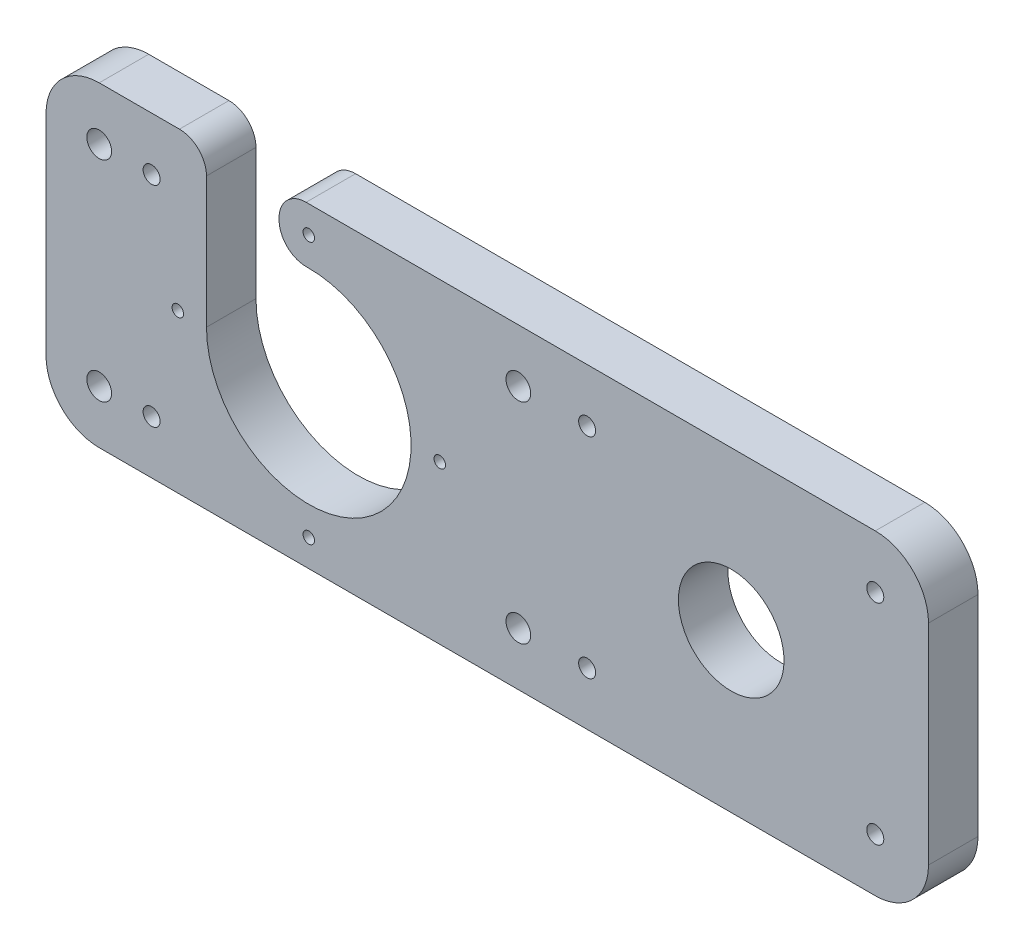
ISO-10303-21;
HEADER;
FILE_DESCRIPTION(('STEP AP214'),'2;1');
FILE_NAME('part.step','',(''),(''),'','','');
FILE_SCHEMA(('AUTOMOTIVE_DESIGN { 1 0 10303 214 1 1 1 1 }'));
ENDSEC;
DATA;
#1=APPLICATION_CONTEXT('core data for automotive mechanical design processes');
#2=APPLICATION_PROTOCOL_DEFINITION('international standard','automotive_design',2000,#1);
#3=PRODUCT_CONTEXT('',#1,'mechanical');
#4=PRODUCT('Part','Part','',(#3));
#5=PRODUCT_RELATED_PRODUCT_CATEGORY('part','',(#4));
#6=PRODUCT_DEFINITION_FORMATION('','',#4);
#7=PRODUCT_DEFINITION_CONTEXT('part definition',#1,'design');
#8=PRODUCT_DEFINITION('design','',#6,#7);
#9=PRODUCT_DEFINITION_SHAPE('','',#8);
#10=(LENGTH_UNIT() NAMED_UNIT(*) SI_UNIT(.MILLI.,.METRE.));
#11=(NAMED_UNIT(*) PLANE_ANGLE_UNIT() SI_UNIT($,.RADIAN.));
#12=(NAMED_UNIT(*) SI_UNIT($,.STERADIAN.) SOLID_ANGLE_UNIT());
#13=UNCERTAINTY_MEASURE_WITH_UNIT(LENGTH_MEASURE(1.E-05),#10,'distance_accuracy_value','');
#14=(GEOMETRIC_REPRESENTATION_CONTEXT(3) GLOBAL_UNCERTAINTY_ASSIGNED_CONTEXT((#13)) GLOBAL_UNIT_ASSIGNED_CONTEXT((#10,
#11,#12)) REPRESENTATION_CONTEXT('',''));
#15=CARTESIAN_POINT('',(0.,0.,0.));
#16=DIRECTION('',(0.,0.,1.));
#17=DIRECTION('',(1.,0.,0.));
#18=AXIS2_PLACEMENT_3D('',#15,#16,#17);
#19=CARTESIAN_POINT('',(0.,38.2,5.8));
#20=DIRECTION('',(0.,-1.,0.));
#21=DIRECTION('',(1.,0.,0.));
#22=AXIS2_PLACEMENT_3D('',#19,#20,#21);
#23=PLANE('',#22);
#24=DIRECTION('',(-1.,0.,0.));
#25=VECTOR('',#24,1.);
#26=CARTESIAN_POINT('',(0.,38.2,-0.1));
#27=LINE('',#26,#25);
#28=CARTESIAN_POINT('',(100.4125,38.2,-0.1));
#29=VERTEX_POINT('',#28);
#30=CARTESIAN_POINT('',(31.425,38.2,-0.1));
#31=VERTEX_POINT('',#30);
#32=EDGE_CURVE('E387',#29,#31,#27,.T.);
#33=ORIENTED_EDGE('',*,*,#32,.T.);
#34=DIRECTION('',(0.,0.,1.));
#35=VECTOR('',#34,1.);
#36=CARTESIAN_POINT('',(31.425,38.2,5.8));
#37=LINE('',#36,#35);
#38=CARTESIAN_POINT('',(31.425,38.2,5.9));
#39=VERTEX_POINT('',#38);
#40=EDGE_CURVE('E12',#31,#39,#37,.T.);
#41=ORIENTED_EDGE('',*,*,#40,.T.);
#42=DIRECTION('',(-1.,0.,0.));
#43=VECTOR('',#42,1.);
#44=CARTESIAN_POINT('',(0.,38.2,5.9));
#45=LINE('',#44,#43);
#46=CARTESIAN_POINT('',(100.4125,38.2,5.9));
#47=VERTEX_POINT('',#46);
#48=EDGE_CURVE('E237',#47,#39,#45,.T.);
#49=ORIENTED_EDGE('',*,*,#48,.F.);
#50=DIRECTION('',(0.,0.,1.));
#51=VECTOR('',#50,1.);
#52=CARTESIAN_POINT('',(100.4125,38.2,5.8));
#53=LINE('',#52,#51);
#54=EDGE_CURVE('E42',#47,#29,#53,.F.);
#55=ORIENTED_EDGE('',*,*,#54,.T.);
#56=EDGE_LOOP('',(#33,#41,#49,#55));
#57=FACE_BOUND('',#56,.T.);
#58=ADVANCED_FACE('F38',(#57),#23,.F.);
#59=CARTESIAN_POINT('',(0.,0.,5.9));
#60=DIRECTION('',(0.,0.,-1.));
#61=DIRECTION('',(-1.,0.,0.));
#62=AXIS2_PLACEMENT_3D('',#59,#60,#61);
#63=PLANE('',#62);
#64=CARTESIAN_POINT('',(6.35,6.35000000000001,5.9));
#65=DIRECTION('',(0.,0.,-1.));
#66=DIRECTION('',(-1.,0.,0.));
#67=AXIS2_PLACEMENT_3D('',#64,#65,#66);
#68=CIRCLE('',#67,1.5);
#69=CARTESIAN_POINT('',(4.85,6.35000000000001,5.9));
#70=VERTEX_POINT('',#69);
#71=EDGE_CURVE('E461',#70,#70,#68,.F.);
#72=ORIENTED_EDGE('',*,*,#71,.F.);
#73=EDGE_LOOP('',(#72));
#74=FACE_BOUND('',#73,.T.);
#75=CARTESIAN_POINT('',(6.35,31.75,5.9));
#76=DIRECTION('',(0.,0.,-1.));
#77=DIRECTION('',(-1.,0.,0.));
#78=AXIS2_PLACEMENT_3D('',#75,#76,#77);
#79=CIRCLE('',#78,1.5);
#80=CARTESIAN_POINT('',(4.85,31.75,5.9));
#81=VERTEX_POINT('',#80);
#82=EDGE_CURVE('E328',#81,#81,#79,.F.);
#83=ORIENTED_EDGE('',*,*,#82,.F.);
#84=EDGE_LOOP('',(#83));
#85=FACE_BOUND('',#84,.T.);
#86=CARTESIAN_POINT('',(57.15,31.75,5.9));
#87=DIRECTION('',(0.,0.,-1.));
#88=DIRECTION('',(-1.,0.,0.));
#89=AXIS2_PLACEMENT_3D('',#86,#87,#88);
#90=CIRCLE('',#89,1.5);
#91=CARTESIAN_POINT('',(55.65,31.75,5.9));
#92=VERTEX_POINT('',#91);
#93=EDGE_CURVE('E333',#92,#92,#90,.F.);
#94=ORIENTED_EDGE('',*,*,#93,.F.);
#95=EDGE_LOOP('',(#94));
#96=FACE_BOUND('',#95,.T.);
#97=CARTESIAN_POINT('',(57.15,6.35,5.9));
#98=DIRECTION('',(0.,0.,-1.));
#99=DIRECTION('',(-1.,0.,0.));
#100=AXIS2_PLACEMENT_3D('',#97,#98,#99);
#101=CIRCLE('',#100,1.5);
#102=CARTESIAN_POINT('',(55.65,6.35,5.9));
#103=VERTEX_POINT('',#102);
#104=EDGE_CURVE('E337',#103,#103,#101,.F.);
#105=ORIENTED_EDGE('',*,*,#104,.F.);
#106=EDGE_LOOP('',(#105));
#107=FACE_BOUND('',#106,.T.);
#108=CARTESIAN_POINT('',(31.75,34.925,5.9));
#109=DIRECTION('',(0.,0.,-1.));
#110=DIRECTION('',(-1.,0.,0.));
#111=AXIS2_PLACEMENT_3D('',#108,#109,#110);
#112=CIRCLE('',#111,0.693749999999993);
#113=CARTESIAN_POINT('',(31.05625,34.925,5.9));
#114=VERTEX_POINT('',#113);
#115=EDGE_CURVE('E341',#114,#114,#112,.F.);
#116=ORIENTED_EDGE('',*,*,#115,.F.);
#117=EDGE_LOOP('',(#116));
#118=FACE_BOUND('',#117,.T.);
#119=CARTESIAN_POINT('',(15.875,19.05,5.9));
#120=DIRECTION('',(0.,0.,-1.));
#121=DIRECTION('',(-1.,0.,0.));
#122=AXIS2_PLACEMENT_3D('',#119,#120,#121);
#123=CIRCLE('',#122,0.693749999999999);
#124=CARTESIAN_POINT('',(15.18125,19.05,5.9));
#125=VERTEX_POINT('',#124);
#126=EDGE_CURVE('E345',#125,#125,#123,.F.);
#127=ORIENTED_EDGE('',*,*,#126,.F.);
#128=EDGE_LOOP('',(#127));
#129=FACE_BOUND('',#128,.T.);
#130=CARTESIAN_POINT('',(31.75,3.175,5.9));
#131=DIRECTION('',(0.,0.,-1.));
#132=DIRECTION('',(-1.,0.,0.));
#133=AXIS2_PLACEMENT_3D('',#130,#131,#132);
#134=CIRCLE('',#133,0.69375);
#135=CARTESIAN_POINT('',(31.05625,3.175,5.9));
#136=VERTEX_POINT('',#135);
#137=EDGE_CURVE('E349',#136,#136,#134,.F.);
#138=ORIENTED_EDGE('',*,*,#137,.F.);
#139=EDGE_LOOP('',(#138));
#140=FACE_BOUND('',#139,.T.);
#141=CARTESIAN_POINT('',(47.625,19.05,5.9));
#142=DIRECTION('',(0.,0.,-1.));
#143=DIRECTION('',(-1.,0.,0.));
#144=AXIS2_PLACEMENT_3D('',#141,#142,#143);
#145=CIRCLE('',#144,0.693749999999999);
#146=CARTESIAN_POINT('',(46.93125,19.05,5.9));
#147=VERTEX_POINT('',#146);
#148=EDGE_CURVE('E353',#147,#147,#145,.F.);
#149=ORIENTED_EDGE('',*,*,#148,.F.);
#150=EDGE_LOOP('',(#149));
#151=FACE_BOUND('',#150,.T.);
#152=CARTESIAN_POINT('',(12.7,31.75,5.9));
#153=DIRECTION('',(0.,0.,-1.));
#154=DIRECTION('',(-1.,0.,0.));
#155=AXIS2_PLACEMENT_3D('',#152,#153,#154);
#156=CIRCLE('',#155,1.0303);
#157=CARTESIAN_POINT('',(11.6697,31.75,5.9));
#158=VERTEX_POINT('',#157);
#159=EDGE_CURVE('E192',#158,#158,#156,.F.);
#160=ORIENTED_EDGE('',*,*,#159,.F.);
#161=EDGE_LOOP('',(#160));
#162=FACE_BOUND('',#161,.T.);
#163=CARTESIAN_POINT('',(12.7,6.35000000000001,5.9));
#164=DIRECTION('',(0.,0.,-1.));
#165=DIRECTION('',(-1.,0.,0.));
#166=AXIS2_PLACEMENT_3D('',#163,#164,#165);
#167=CIRCLE('',#166,1.0303);
#168=CARTESIAN_POINT('',(11.6697,6.35000000000001,5.9));
#169=VERTEX_POINT('',#168);
#170=EDGE_CURVE('E303',#169,#169,#167,.F.);
#171=ORIENTED_EDGE('',*,*,#170,.F.);
#172=EDGE_LOOP('',(#171));
#173=FACE_BOUND('',#172,.T.);
#174=CARTESIAN_POINT('',(100.4125,6.35000000000001,5.9));
#175=DIRECTION('',(0.,0.,-1.));
#176=DIRECTION('',(-1.,0.,0.));
#177=AXIS2_PLACEMENT_3D('',#174,#175,#176);
#178=CIRCLE('',#177,1.0303);
#179=CARTESIAN_POINT('',(99.3822,6.35000000000001,5.9));
#180=VERTEX_POINT('',#179);
#181=EDGE_CURVE('E307',#180,#180,#178,.F.);
#182=ORIENTED_EDGE('',*,*,#181,.F.);
#183=EDGE_LOOP('',(#182));
#184=FACE_BOUND('',#183,.T.);
#185=CARTESIAN_POINT('',(100.4125,31.75,5.9));
#186=DIRECTION('',(0.,0.,-1.));
#187=DIRECTION('',(-1.,0.,0.));
#188=AXIS2_PLACEMENT_3D('',#185,#186,#187);
#189=CIRCLE('',#188,1.0303);
#190=CARTESIAN_POINT('',(99.3822,31.75,5.9));
#191=VERTEX_POINT('',#190);
#192=EDGE_CURVE('E311',#191,#191,#189,.F.);
#193=ORIENTED_EDGE('',*,*,#192,.F.);
#194=EDGE_LOOP('',(#193));
#195=FACE_BOUND('',#194,.T.);
#196=CARTESIAN_POINT('',(65.4875,31.75,5.9));
#197=DIRECTION('',(0.,0.,-1.));
#198=DIRECTION('',(-1.,0.,0.));
#199=AXIS2_PLACEMENT_3D('',#196,#197,#198);
#200=CIRCLE('',#199,1.0303);
#201=CARTESIAN_POINT('',(64.4572,31.75,5.9));
#202=VERTEX_POINT('',#201);
#203=EDGE_CURVE('E315',#202,#202,#200,.F.);
#204=ORIENTED_EDGE('',*,*,#203,.F.);
#205=EDGE_LOOP('',(#204));
#206=FACE_BOUND('',#205,.T.);
#207=CARTESIAN_POINT('',(65.4875,6.35000000000001,5.9));
#208=DIRECTION('',(0.,0.,-1.));
#209=DIRECTION('',(-1.,0.,0.));
#210=AXIS2_PLACEMENT_3D('',#207,#208,#209);
#211=CIRCLE('',#210,1.0303);
#212=CARTESIAN_POINT('',(64.4572,6.35000000000001,5.9));
#213=VERTEX_POINT('',#212);
#214=EDGE_CURVE('E319',#213,#213,#211,.F.);
#215=ORIENTED_EDGE('',*,*,#214,.F.);
#216=EDGE_LOOP('',(#215));
#217=FACE_BOUND('',#216,.T.);
#218=CARTESIAN_POINT('',(82.95,19.05,5.9));
#219=DIRECTION('',(0.,0.,-1.));
#220=DIRECTION('',(-1.,0.,0.));
#221=AXIS2_PLACEMENT_3D('',#218,#219,#220);
#222=CIRCLE('',#221,6.4);
#223=CARTESIAN_POINT('',(76.55,19.05,5.9));
#224=VERTEX_POINT('',#223);
#225=EDGE_CURVE('E326',#224,#224,#222,.F.);
#226=ORIENTED_EDGE('',*,*,#225,.F.);
#227=EDGE_LOOP('',(#226));
#228=FACE_BOUND('',#227,.T.);
#229=DIRECTION('',(0.,1.,0.));
#230=VECTOR('',#229,1.);
#231=CARTESIAN_POINT('',(28.15,19.05,5.9));
#232=LINE('',#231,#230);
#233=CARTESIAN_POINT('',(28.15,34.7216304193278,5.9));
#234=VERTEX_POINT('',#233);
#235=CARTESIAN_POINT('',(28.15,34.925,5.9));
#236=VERTEX_POINT('',#235);
#237=EDGE_CURVE('E372',#234,#236,#232,.T.);
#238=ORIENTED_EDGE('',*,*,#237,.F.);
#239=CARTESIAN_POINT('',(31.425,34.7216304193278,5.9));
#240=DIRECTION('',(0.,0.,-1.));
#241=DIRECTION('',(-1.,0.,0.));
#242=AXIS2_PLACEMENT_3D('',#239,#240,#241);
#243=CIRCLE('',#242,3.275);
#244=CARTESIAN_POINT('',(31.4929027113238,31.4473344306006,5.9));
#245=VERTEX_POINT('',#244);
#246=EDGE_CURVE('E179',#234,#245,#243,.F.);
#247=ORIENTED_EDGE('',*,*,#246,.T.);
#248=CARTESIAN_POINT('',(31.75,19.05,5.9));
#249=DIRECTION('',(0.,0.,-1.));
#250=DIRECTION('',(-1.,0.,0.));
#251=AXIS2_PLACEMENT_3D('',#248,#249,#250);
#252=CIRCLE('',#251,12.4);
#253=CARTESIAN_POINT('',(19.35,19.05,5.9));
#254=VERTEX_POINT('',#253);
#255=EDGE_CURVE('E327',#254,#245,#252,.F.);
#256=ORIENTED_EDGE('',*,*,#255,.F.);
#257=DIRECTION('',(0.,-1.,0.));
#258=VECTOR('',#257,1.);
#259=CARTESIAN_POINT('',(19.35,19.05,5.9));
#260=LINE('',#259,#258);
#261=CARTESIAN_POINT('',(19.35,34.925,5.9));
#262=VERTEX_POINT('',#261);
#263=EDGE_CURVE('E176',#262,#254,#260,.T.);
#264=ORIENTED_EDGE('',*,*,#263,.F.);
#265=CARTESIAN_POINT('',(16.075,34.925,5.9));
#266=DIRECTION('',(0.,0.,-1.));
#267=DIRECTION('',(-1.,0.,0.));
#268=AXIS2_PLACEMENT_3D('',#265,#266,#267);
#269=CIRCLE('',#268,3.275);
#270=CARTESIAN_POINT('',(16.075,38.2,5.9));
#271=VERTEX_POINT('',#270);
#272=EDGE_CURVE('E182',#262,#271,#269,.F.);
#273=ORIENTED_EDGE('',*,*,#272,.T.);
#274=DIRECTION('',(-1.,0.,0.));
#275=VECTOR('',#274,1.);
#276=CARTESIAN_POINT('',(0.,38.2,5.9));
#277=LINE('',#276,#275);
#278=CARTESIAN_POINT('',(6.35,38.2,5.9));
#279=VERTEX_POINT('',#278);
#280=EDGE_CURVE('E235',#271,#279,#277,.T.);
#281=ORIENTED_EDGE('',*,*,#280,.T.);
#282=CARTESIAN_POINT('',(6.35,31.75,5.9));
#283=DIRECTION('',(0.,0.,-1.));
#284=DIRECTION('',(-1.,0.,0.));
#285=AXIS2_PLACEMENT_3D('',#282,#283,#284);
#286=CIRCLE('',#285,6.45);
#287=CARTESIAN_POINT('',(-0.1,31.75,5.9));
#288=VERTEX_POINT('',#287);
#289=EDGE_CURVE('E205',#279,#288,#286,.F.);
#290=ORIENTED_EDGE('',*,*,#289,.T.);
#291=DIRECTION('',(0.,-1.,0.));
#292=VECTOR('',#291,1.);
#293=CARTESIAN_POINT('',(-0.1,0.,5.9));
#294=LINE('',#293,#292);
#295=CARTESIAN_POINT('',(-0.1,6.35,5.9));
#296=VERTEX_POINT('',#295);
#297=EDGE_CURVE('E210',#288,#296,#294,.T.);
#298=ORIENTED_EDGE('',*,*,#297,.T.);
#299=CARTESIAN_POINT('',(6.34999999999999,6.35,5.9));
#300=DIRECTION('',(0.,0.,-1.));
#301=DIRECTION('',(-1.,0.,0.));
#302=AXIS2_PLACEMENT_3D('',#299,#300,#301);
#303=CIRCLE('',#302,6.45);
#304=CARTESIAN_POINT('',(6.34999999999999,-0.1,5.9));
#305=VERTEX_POINT('',#304);
#306=EDGE_CURVE('E214',#296,#305,#303,.F.);
#307=ORIENTED_EDGE('',*,*,#306,.T.);
#308=DIRECTION('',(1.,0.,0.));
#309=VECTOR('',#308,1.);
#310=CARTESIAN_POINT('',(0.,-0.1,5.9));
#311=LINE('',#310,#309);
#312=CARTESIAN_POINT('',(100.4125,-0.1,5.9));
#313=VERTEX_POINT('',#312);
#314=EDGE_CURVE('E230',#305,#313,#311,.T.);
#315=ORIENTED_EDGE('',*,*,#314,.T.);
#316=CARTESIAN_POINT('',(100.4125,6.35,5.9));
#317=DIRECTION('',(0.,0.,-1.));
#318=DIRECTION('',(-1.,0.,0.));
#319=AXIS2_PLACEMENT_3D('',#316,#317,#318);
#320=CIRCLE('',#319,6.45);
#321=CARTESIAN_POINT('',(106.8625,6.35,5.9));
#322=VERTEX_POINT('',#321);
#323=EDGE_CURVE('E220',#313,#322,#320,.F.);
#324=ORIENTED_EDGE('',*,*,#323,.T.);
#325=DIRECTION('',(0.,1.,0.));
#326=VECTOR('',#325,1.);
#327=CARTESIAN_POINT('',(106.8625,0.,5.9));
#328=LINE('',#327,#326);
#329=CARTESIAN_POINT('',(106.8625,31.75,5.9));
#330=VERTEX_POINT('',#329);
#331=EDGE_CURVE('E231',#322,#330,#328,.T.);
#332=ORIENTED_EDGE('',*,*,#331,.T.);
#333=CARTESIAN_POINT('',(100.4125,31.75,5.9));
#334=DIRECTION('',(0.,0.,-1.));
#335=DIRECTION('',(-1.,0.,0.));
#336=AXIS2_PLACEMENT_3D('',#333,#334,#335);
#337=CIRCLE('',#336,6.45);
#338=EDGE_CURVE('E225',#330,#47,#337,.F.);
#339=ORIENTED_EDGE('',*,*,#338,.T.);
#340=ORIENTED_EDGE('',*,*,#48,.T.);
#341=CARTESIAN_POINT('',(31.425,34.925,5.9));
#342=DIRECTION('',(0.,0.,-1.));
#343=DIRECTION('',(-1.,0.,0.));
#344=AXIS2_PLACEMENT_3D('',#341,#342,#343);
#345=CIRCLE('',#344,3.275);
#346=EDGE_CURVE('E180',#39,#236,#345,.F.);
#347=ORIENTED_EDGE('',*,*,#346,.T.);
#348=EDGE_LOOP('',(#238,#247,#256,#264,#273,#281,#290,#298,#307,#315,#324,#332,#339,#340,#347));
#349=FACE_BOUND('',#348,.T.);
#350=ADVANCED_FACE('F40',(#74,#85,#96,#107,#118,#129,#140,#151,#162,#173,#184,#195,#206,#217,
#228,#349),#63,.F.);
#351=CARTESIAN_POINT('',(0.,0.,-0.1));
#352=DIRECTION('',(0.,0.,-1.));
#353=DIRECTION('',(-1.,0.,0.));
#354=AXIS2_PLACEMENT_3D('',#351,#352,#353);
#355=PLANE('',#354);
#356=CARTESIAN_POINT('',(6.35,6.35000000000001,-0.1));
#357=DIRECTION('',(0.,0.,-1.));
#358=DIRECTION('',(-1.,0.,0.));
#359=AXIS2_PLACEMENT_3D('',#356,#357,#358);
#360=CIRCLE('',#359,1.5);
#361=CARTESIAN_POINT('',(4.85,6.35000000000001,-0.1));
#362=VERTEX_POINT('',#361);
#363=EDGE_CURVE('E332',#362,#362,#360,.F.);
#364=ORIENTED_EDGE('',*,*,#363,.T.);
#365=EDGE_LOOP('',(#364));
#366=FACE_BOUND('',#365,.T.);
#367=CARTESIAN_POINT('',(6.35,31.75,-0.1));
#368=DIRECTION('',(0.,0.,-1.));
#369=DIRECTION('',(-1.,0.,0.));
#370=AXIS2_PLACEMENT_3D('',#367,#368,#369);
#371=CIRCLE('',#370,1.5);
#372=CARTESIAN_POINT('',(4.85,31.75,-0.1));
#373=VERTEX_POINT('',#372);
#374=EDGE_CURVE('E331',#373,#373,#371,.F.);
#375=ORIENTED_EDGE('',*,*,#374,.T.);
#376=EDGE_LOOP('',(#375));
#377=FACE_BOUND('',#376,.T.);
#378=CARTESIAN_POINT('',(57.15,31.75,-0.1));
#379=DIRECTION('',(0.,0.,-1.));
#380=DIRECTION('',(-1.,0.,0.));
#381=AXIS2_PLACEMENT_3D('',#378,#379,#380);
#382=CIRCLE('',#381,1.5);
#383=CARTESIAN_POINT('',(55.65,31.75,-0.1));
#384=VERTEX_POINT('',#383);
#385=EDGE_CURVE('E336',#384,#384,#382,.F.);
#386=ORIENTED_EDGE('',*,*,#385,.T.);
#387=EDGE_LOOP('',(#386));
#388=FACE_BOUND('',#387,.T.);
#389=CARTESIAN_POINT('',(57.15,6.35,-0.1));
#390=DIRECTION('',(0.,0.,-1.));
#391=DIRECTION('',(-1.,0.,0.));
#392=AXIS2_PLACEMENT_3D('',#389,#390,#391);
#393=CIRCLE('',#392,1.5);
#394=CARTESIAN_POINT('',(55.65,6.35,-0.1));
#395=VERTEX_POINT('',#394);
#396=EDGE_CURVE('E340',#395,#395,#393,.F.);
#397=ORIENTED_EDGE('',*,*,#396,.T.);
#398=EDGE_LOOP('',(#397));
#399=FACE_BOUND('',#398,.T.);
#400=CARTESIAN_POINT('',(31.75,34.925,-0.1));
#401=DIRECTION('',(0.,0.,-1.));
#402=DIRECTION('',(-1.,0.,0.));
#403=AXIS2_PLACEMENT_3D('',#400,#401,#402);
#404=CIRCLE('',#403,0.693749999999993);
#405=CARTESIAN_POINT('',(31.05625,34.925,-0.1));
#406=VERTEX_POINT('',#405);
#407=EDGE_CURVE('E344',#406,#406,#404,.F.);
#408=ORIENTED_EDGE('',*,*,#407,.T.);
#409=EDGE_LOOP('',(#408));
#410=FACE_BOUND('',#409,.T.);
#411=CARTESIAN_POINT('',(15.875,19.05,-0.1));
#412=DIRECTION('',(0.,0.,-1.));
#413=DIRECTION('',(-1.,0.,0.));
#414=AXIS2_PLACEMENT_3D('',#411,#412,#413);
#415=CIRCLE('',#414,0.693749999999999);
#416=CARTESIAN_POINT('',(15.18125,19.05,-0.1));
#417=VERTEX_POINT('',#416);
#418=EDGE_CURVE('E348',#417,#417,#415,.F.);
#419=ORIENTED_EDGE('',*,*,#418,.T.);
#420=EDGE_LOOP('',(#419));
#421=FACE_BOUND('',#420,.T.);
#422=CARTESIAN_POINT('',(31.75,3.175,-0.1));
#423=DIRECTION('',(0.,0.,-1.));
#424=DIRECTION('',(-1.,0.,0.));
#425=AXIS2_PLACEMENT_3D('',#422,#423,#424);
#426=CIRCLE('',#425,0.69375);
#427=CARTESIAN_POINT('',(31.05625,3.175,-0.1));
#428=VERTEX_POINT('',#427);
#429=EDGE_CURVE('E352',#428,#428,#426,.F.);
#430=ORIENTED_EDGE('',*,*,#429,.T.);
#431=EDGE_LOOP('',(#430));
#432=FACE_BOUND('',#431,.T.);
#433=CARTESIAN_POINT('',(47.625,19.05,-0.1));
#434=DIRECTION('',(0.,0.,-1.));
#435=DIRECTION('',(-1.,0.,0.));
#436=AXIS2_PLACEMENT_3D('',#433,#434,#435);
#437=CIRCLE('',#436,0.693749999999999);
#438=CARTESIAN_POINT('',(46.93125,19.05,-0.1));
#439=VERTEX_POINT('',#438);
#440=EDGE_CURVE('E356',#439,#439,#437,.F.);
#441=ORIENTED_EDGE('',*,*,#440,.T.);
#442=EDGE_LOOP('',(#441));
#443=FACE_BOUND('',#442,.T.);
#444=CARTESIAN_POINT('',(31.75,19.05,-0.1));
#445=DIRECTION('',(0.,0.,-1.));
#446=DIRECTION('',(-1.,0.,0.));
#447=AXIS2_PLACEMENT_3D('',#444,#445,#446);
#448=CIRCLE('',#447,12.4);
#449=CARTESIAN_POINT('',(19.35,19.05,-0.1));
#450=VERTEX_POINT('',#449);
#451=CARTESIAN_POINT('',(31.4929027113238,31.4473344306006,-0.1));
#452=VERTEX_POINT('',#451);
#453=EDGE_CURVE('E161',#450,#452,#448,.F.);
#454=ORIENTED_EDGE('',*,*,#453,.T.);
#455=CARTESIAN_POINT('',(31.425,34.7216304193278,-0.1));
#456=DIRECTION('',(0.,0.,-1.));
#457=DIRECTION('',(-1.,0.,0.));
#458=AXIS2_PLACEMENT_3D('',#455,#456,#457);
#459=CIRCLE('',#458,3.275);
#460=CARTESIAN_POINT('',(28.15,34.7216304193278,-0.1));
#461=VERTEX_POINT('',#460);
#462=EDGE_CURVE('E154',#452,#461,#459,.T.);
#463=ORIENTED_EDGE('',*,*,#462,.T.);
#464=DIRECTION('',(0.,1.,0.));
#465=VECTOR('',#464,1.);
#466=CARTESIAN_POINT('',(28.15,19.05,-0.1));
#467=LINE('',#466,#465);
#468=CARTESIAN_POINT('',(28.15,34.925,-0.1));
#469=VERTEX_POINT('',#468);
#470=EDGE_CURVE('E158',#461,#469,#467,.T.);
#471=ORIENTED_EDGE('',*,*,#470,.T.);
#472=CARTESIAN_POINT('',(31.425,34.925,-0.1));
#473=DIRECTION('',(0.,0.,-1.));
#474=DIRECTION('',(-1.,0.,0.));
#475=AXIS2_PLACEMENT_3D('',#472,#473,#474);
#476=CIRCLE('',#475,3.275);
#477=EDGE_CURVE('E188',#469,#31,#476,.T.);
#478=ORIENTED_EDGE('',*,*,#477,.T.);
#479=ORIENTED_EDGE('',*,*,#32,.F.);
#480=CARTESIAN_POINT('',(100.4125,31.75,-0.1));
#481=DIRECTION('',(0.,0.,-1.));
#482=DIRECTION('',(-1.,0.,0.));
#483=AXIS2_PLACEMENT_3D('',#480,#481,#482);
#484=CIRCLE('',#483,6.45);
#485=CARTESIAN_POINT('',(106.8625,31.75,-0.1));
#486=VERTEX_POINT('',#485);
#487=EDGE_CURVE('E394',#29,#486,#484,.T.);
#488=ORIENTED_EDGE('',*,*,#487,.T.);
#489=DIRECTION('',(0.,1.,0.));
#490=VECTOR('',#489,1.);
#491=CARTESIAN_POINT('',(106.8625,0.,-0.1));
#492=LINE('',#491,#490);
#493=CARTESIAN_POINT('',(106.8625,6.35,-0.1));
#494=VERTEX_POINT('',#493);
#495=EDGE_CURVE('E392',#494,#486,#492,.T.);
#496=ORIENTED_EDGE('',*,*,#495,.F.);
#497=CARTESIAN_POINT('',(100.4125,6.35,-0.1));
#498=DIRECTION('',(0.,0.,-1.));
#499=DIRECTION('',(-1.,0.,0.));
#500=AXIS2_PLACEMENT_3D('',#497,#498,#499);
#501=CIRCLE('',#500,6.45);
#502=CARTESIAN_POINT('',(100.4125,-0.1,-0.1));
#503=VERTEX_POINT('',#502);
#504=EDGE_CURVE('E396',#494,#503,#501,.T.);
#505=ORIENTED_EDGE('',*,*,#504,.T.);
#506=DIRECTION('',(1.,0.,0.));
#507=VECTOR('',#506,1.);
#508=CARTESIAN_POINT('',(0.,-0.1,-0.1));
#509=LINE('',#508,#507);
#510=CARTESIAN_POINT('',(6.34999999999999,-0.1,-0.1));
#511=VERTEX_POINT('',#510);
#512=EDGE_CURVE('E371',#511,#503,#509,.T.);
#513=ORIENTED_EDGE('',*,*,#512,.F.);
#514=CARTESIAN_POINT('',(6.34999999999999,6.35,-0.1));
#515=DIRECTION('',(0.,0.,-1.));
#516=DIRECTION('',(-1.,0.,0.));
#517=AXIS2_PLACEMENT_3D('',#514,#515,#516);
#518=CIRCLE('',#517,6.45);
#519=CARTESIAN_POINT('',(-0.1,6.35,-0.1));
#520=VERTEX_POINT('',#519);
#521=EDGE_CURVE('E203',#511,#520,#518,.T.);
#522=ORIENTED_EDGE('',*,*,#521,.T.);
#523=DIRECTION('',(0.,-1.,0.));
#524=VECTOR('',#523,1.);
#525=CARTESIAN_POINT('',(-0.1,0.,-0.1));
#526=LINE('',#525,#524);
#527=CARTESIAN_POINT('',(-0.1,31.75,-0.1));
#528=VERTEX_POINT('',#527);
#529=EDGE_CURVE('E232',#528,#520,#526,.T.);
#530=ORIENTED_EDGE('',*,*,#529,.F.);
#531=CARTESIAN_POINT('',(6.35,31.75,-0.1));
#532=DIRECTION('',(0.,0.,-1.));
#533=DIRECTION('',(-1.,0.,0.));
#534=AXIS2_PLACEMENT_3D('',#531,#532,#533);
#535=CIRCLE('',#534,6.45);
#536=CARTESIAN_POINT('',(6.35,38.2,-0.1));
#537=VERTEX_POINT('',#536);
#538=EDGE_CURVE('E131',#528,#537,#535,.T.);
#539=ORIENTED_EDGE('',*,*,#538,.T.);
#540=DIRECTION('',(-1.,0.,0.));
#541=VECTOR('',#540,1.);
#542=CARTESIAN_POINT('',(0.,38.2,-0.1));
#543=LINE('',#542,#541);
#544=CARTESIAN_POINT('',(16.075,38.2,-0.1));
#545=VERTEX_POINT('',#544);
#546=EDGE_CURVE('E297',#545,#537,#543,.T.);
#547=ORIENTED_EDGE('',*,*,#546,.F.);
#548=CARTESIAN_POINT('',(16.075,34.925,-0.1));
#549=DIRECTION('',(0.,0.,-1.));
#550=DIRECTION('',(-1.,0.,0.));
#551=AXIS2_PLACEMENT_3D('',#548,#549,#550);
#552=CIRCLE('',#551,3.275);
#553=CARTESIAN_POINT('',(19.35,34.925,-0.1));
#554=VERTEX_POINT('',#553);
#555=EDGE_CURVE('E57',#545,#554,#552,.T.);
#556=ORIENTED_EDGE('',*,*,#555,.T.);
#557=DIRECTION('',(0.,-1.,0.));
#558=VECTOR('',#557,1.);
#559=CARTESIAN_POINT('',(19.35,19.05,-0.1));
#560=LINE('',#559,#558);
#561=EDGE_CURVE('E175',#554,#450,#560,.T.);
#562=ORIENTED_EDGE('',*,*,#561,.T.);
#563=EDGE_LOOP('',(#454,#463,#471,#478,#479,#488,#496,#505,#513,#522,#530,#539,#547,#556,#562));
#564=FACE_BOUND('',#563,.T.);
#565=CARTESIAN_POINT('',(12.7,31.75,-0.1));
#566=DIRECTION('',(0.,0.,-1.));
#567=DIRECTION('',(-1.,0.,0.));
#568=AXIS2_PLACEMENT_3D('',#565,#566,#567);
#569=CIRCLE('',#568,1.0303);
#570=CARTESIAN_POINT('',(11.6697,31.75,-0.1));
#571=VERTEX_POINT('',#570);
#572=EDGE_CURVE('E300',#571,#571,#569,.T.);
#573=ORIENTED_EDGE('',*,*,#572,.F.);
#574=EDGE_LOOP('',(#573));
#575=FACE_BOUND('',#574,.T.);
#576=CARTESIAN_POINT('',(12.7,6.35000000000001,-0.1));
#577=DIRECTION('',(0.,0.,-1.));
#578=DIRECTION('',(-1.,0.,0.));
#579=AXIS2_PLACEMENT_3D('',#576,#577,#578);
#580=CIRCLE('',#579,1.0303);
#581=CARTESIAN_POINT('',(11.6697,6.35000000000001,-0.1));
#582=VERTEX_POINT('',#581);
#583=EDGE_CURVE('E304',#582,#582,#580,.T.);
#584=ORIENTED_EDGE('',*,*,#583,.F.);
#585=EDGE_LOOP('',(#584));
#586=FACE_BOUND('',#585,.T.);
#587=CARTESIAN_POINT('',(100.4125,6.35000000000001,-0.1));
#588=DIRECTION('',(0.,0.,-1.));
#589=DIRECTION('',(-1.,0.,0.));
#590=AXIS2_PLACEMENT_3D('',#587,#588,#589);
#591=CIRCLE('',#590,1.0303);
#592=CARTESIAN_POINT('',(99.3822,6.35000000000001,-0.1));
#593=VERTEX_POINT('',#592);
#594=EDGE_CURVE('E308',#593,#593,#591,.T.);
#595=ORIENTED_EDGE('',*,*,#594,.F.);
#596=EDGE_LOOP('',(#595));
#597=FACE_BOUND('',#596,.T.);
#598=CARTESIAN_POINT('',(100.4125,31.75,-0.1));
#599=DIRECTION('',(0.,0.,-1.));
#600=DIRECTION('',(-1.,0.,0.));
#601=AXIS2_PLACEMENT_3D('',#598,#599,#600);
#602=CIRCLE('',#601,1.0303);
#603=CARTESIAN_POINT('',(99.3822,31.75,-0.1));
#604=VERTEX_POINT('',#603);
#605=EDGE_CURVE('E312',#604,#604,#602,.T.);
#606=ORIENTED_EDGE('',*,*,#605,.F.);
#607=EDGE_LOOP('',(#606));
#608=FACE_BOUND('',#607,.T.);
#609=CARTESIAN_POINT('',(65.4875,31.75,-0.1));
#610=DIRECTION('',(0.,0.,-1.));
#611=DIRECTION('',(-1.,0.,0.));
#612=AXIS2_PLACEMENT_3D('',#609,#610,#611);
#613=CIRCLE('',#612,1.0303);
#614=CARTESIAN_POINT('',(64.4572,31.75,-0.1));
#615=VERTEX_POINT('',#614);
#616=EDGE_CURVE('E316',#615,#615,#613,.T.);
#617=ORIENTED_EDGE('',*,*,#616,.F.);
#618=EDGE_LOOP('',(#617));
#619=FACE_BOUND('',#618,.T.);
#620=CARTESIAN_POINT('',(65.4875,6.35000000000001,-0.1));
#621=DIRECTION('',(0.,0.,-1.));
#622=DIRECTION('',(-1.,0.,0.));
#623=AXIS2_PLACEMENT_3D('',#620,#621,#622);
#624=CIRCLE('',#623,1.0303);
#625=CARTESIAN_POINT('',(64.4572,6.35000000000001,-0.1));
#626=VERTEX_POINT('',#625);
#627=EDGE_CURVE('E320',#626,#626,#624,.T.);
#628=ORIENTED_EDGE('',*,*,#627,.F.);
#629=EDGE_LOOP('',(#628));
#630=FACE_BOUND('',#629,.T.);
#631=CARTESIAN_POINT('',(82.95,19.05,-0.1));
#632=DIRECTION('',(0.,0.,-1.));
#633=DIRECTION('',(-1.,0.,0.));
#634=AXIS2_PLACEMENT_3D('',#631,#632,#633);
#635=CIRCLE('',#634,6.4);
#636=CARTESIAN_POINT('',(76.55,19.05,-0.1));
#637=VERTEX_POINT('',#636);
#638=EDGE_CURVE('E323',#637,#637,#635,.F.);
#639=ORIENTED_EDGE('',*,*,#638,.T.);
#640=EDGE_LOOP('',(#639));
#641=FACE_BOUND('',#640,.T.);
#642=ADVANCED_FACE('F156',(#366,#377,#388,#399,#410,#421,#432,#443,#564,#575,#586,#597,#608,
#619,#630,#641),#355,.T.);
#643=CARTESIAN_POINT('',(106.7625,-0.1,5.8));
#644=DIRECTION('',(0.,1.,0.));
#645=DIRECTION('',(0.,0.,1.));
#646=AXIS2_PLACEMENT_3D('',#643,#644,#645);
#647=PLANE('',#646);
#648=ORIENTED_EDGE('',*,*,#314,.F.);
#649=DIRECTION('',(0.,0.,1.));
#650=VECTOR('',#649,1.);
#651=CARTESIAN_POINT('',(6.34999999999999,-0.1,5.8));
#652=LINE('',#651,#650);
#653=EDGE_CURVE('E206',#305,#511,#652,.F.);
#654=ORIENTED_EDGE('',*,*,#653,.T.);
#655=ORIENTED_EDGE('',*,*,#512,.T.);
#656=DIRECTION('',(0.,0.,1.));
#657=VECTOR('',#656,1.);
#658=CARTESIAN_POINT('',(100.4125,-0.1,5.8));
#659=LINE('',#658,#657);
#660=EDGE_CURVE('E123',#503,#313,#659,.T.);
#661=ORIENTED_EDGE('',*,*,#660,.T.);
#662=EDGE_LOOP('',(#648,#654,#655,#661));
#663=FACE_BOUND('',#662,.T.);
#664=ADVANCED_FACE('F286',(#663),#647,.F.);
#665=CARTESIAN_POINT('',(106.8625,38.1,5.8));
#666=DIRECTION('',(-1.,0.,0.));
#667=DIRECTION('',(0.,0.,1.));
#668=AXIS2_PLACEMENT_3D('',#665,#666,#667);
#669=PLANE('',#668);
#670=ORIENTED_EDGE('',*,*,#331,.F.);
#671=DIRECTION('',(0.,0.,1.));
#672=VECTOR('',#671,1.);
#673=CARTESIAN_POINT('',(106.8625,6.35,5.8));
#674=LINE('',#673,#672);
#675=EDGE_CURVE('E199',#322,#494,#674,.F.);
#676=ORIENTED_EDGE('',*,*,#675,.T.);
#677=ORIENTED_EDGE('',*,*,#495,.T.);
#678=DIRECTION('',(0.,0.,1.));
#679=VECTOR('',#678,1.);
#680=CARTESIAN_POINT('',(106.8625,31.75,5.8));
#681=LINE('',#680,#679);
#682=EDGE_CURVE('E212',#486,#330,#681,.T.);
#683=ORIENTED_EDGE('',*,*,#682,.T.);
#684=EDGE_LOOP('',(#670,#676,#677,#683));
#685=FACE_BOUND('',#684,.T.);
#686=ADVANCED_FACE('F278',(#685),#669,.F.);
#687=ORIENTED_EDGE('',*,*,#280,.F.);
#688=DIRECTION('',(0.,0.,1.));
#689=VECTOR('',#688,1.);
#690=CARTESIAN_POINT('',(16.075,38.2,5.8));
#691=LINE('',#690,#689);
#692=EDGE_CURVE('E48',#271,#545,#691,.F.);
#693=ORIENTED_EDGE('',*,*,#692,.T.);
#694=ORIENTED_EDGE('',*,*,#546,.T.);
#695=DIRECTION('',(0.,0.,1.));
#696=VECTOR('',#695,1.);
#697=CARTESIAN_POINT('',(6.35,38.2,5.8));
#698=LINE('',#697,#696);
#699=EDGE_CURVE('E196',#537,#279,#698,.T.);
#700=ORIENTED_EDGE('',*,*,#699,.T.);
#701=EDGE_LOOP('',(#687,#693,#694,#700));
#702=FACE_BOUND('',#701,.T.);
#703=ADVANCED_FACE('F269',(#702),#23,.F.);
#704=CARTESIAN_POINT('',(-0.1,0.,5.8));
#705=DIRECTION('',(1.,0.,0.));
#706=DIRECTION('',(0.,0.,-1.));
#707=AXIS2_PLACEMENT_3D('',#704,#705,#706);
#708=PLANE('',#707);
#709=ORIENTED_EDGE('',*,*,#529,.T.);
#710=DIRECTION('',(0.,0.,-1.));
#711=VECTOR('',#710,1.);
#712=CARTESIAN_POINT('',(-0.1,6.35,5.8));
#713=LINE('',#712,#711);
#714=EDGE_CURVE('E202',#520,#296,#713,.F.);
#715=ORIENTED_EDGE('',*,*,#714,.T.);
#716=ORIENTED_EDGE('',*,*,#297,.F.);
#717=DIRECTION('',(0.,0.,-1.));
#718=VECTOR('',#717,1.);
#719=CARTESIAN_POINT('',(-0.1,31.75,5.8));
#720=LINE('',#719,#718);
#721=EDGE_CURVE('E200',#288,#528,#720,.T.);
#722=ORIENTED_EDGE('',*,*,#721,.T.);
#723=EDGE_LOOP('',(#709,#715,#716,#722));
#724=FACE_BOUND('',#723,.T.);
#725=ADVANCED_FACE('F248',(#724),#708,.F.);
#726=CARTESIAN_POINT('',(82.95,19.05,5.8));
#727=DIRECTION('',(0.,0.,-1.));
#728=DIRECTION('',(-1.,0.,0.));
#729=AXIS2_PLACEMENT_3D('',#726,#727,#728);
#730=CYLINDRICAL_SURFACE('',#729,6.4);
#731=ORIENTED_EDGE('',*,*,#225,.T.);
#732=EDGE_LOOP('',(#731));
#733=FACE_BOUND('',#732,.T.);
#734=ORIENTED_EDGE('',*,*,#638,.F.);
#735=EDGE_LOOP('',(#734));
#736=FACE_BOUND('',#735,.T.);
#737=ADVANCED_FACE('F284',(#733,#736),#730,.F.);
#738=CARTESIAN_POINT('',(31.75,19.05,5.8));
#739=DIRECTION('',(0.,0.,-1.));
#740=DIRECTION('',(-1.,0.,0.));
#741=AXIS2_PLACEMENT_3D('',#738,#739,#740);
#742=CYLINDRICAL_SURFACE('',#741,12.4);
#743=ORIENTED_EDGE('',*,*,#255,.T.);
#744=DIRECTION('',(0.,0.,-1.));
#745=VECTOR('',#744,1.);
#746=CARTESIAN_POINT('',(31.4929027113238,31.4473344306006,5.8));
#747=LINE('',#746,#745);
#748=EDGE_CURVE('E186',#245,#452,#747,.T.);
#749=ORIENTED_EDGE('',*,*,#748,.T.);
#750=ORIENTED_EDGE('',*,*,#453,.F.);
#751=DIRECTION('',(0.,0.,-1.));
#752=VECTOR('',#751,1.);
#753=CARTESIAN_POINT('',(19.35,19.05,5.8));
#754=LINE('',#753,#752);
#755=EDGE_CURVE('E189',#450,#254,#754,.F.);
#756=ORIENTED_EDGE('',*,*,#755,.T.);
#757=EDGE_LOOP('',(#743,#749,#750,#756));
#758=FACE_BOUND('',#757,.T.);
#759=ADVANCED_FACE('F382',(#758),#742,.F.);
#760=CARTESIAN_POINT('',(6.34999999999999,6.35,5.8));
#761=DIRECTION('',(0.,0.,-1.));
#762=DIRECTION('',(-1.,0.,0.));
#763=AXIS2_PLACEMENT_3D('',#760,#761,#762);
#764=CYLINDRICAL_SURFACE('',#763,6.45);
#765=ORIENTED_EDGE('',*,*,#306,.F.);
#766=ORIENTED_EDGE('',*,*,#714,.F.);
#767=ORIENTED_EDGE('',*,*,#521,.F.);
#768=ORIENTED_EDGE('',*,*,#653,.F.);
#769=EDGE_LOOP('',(#765,#766,#767,#768));
#770=FACE_BOUND('',#769,.T.);
#771=ADVANCED_FACE('F402',(#770),#764,.T.);
#772=CARTESIAN_POINT('',(100.4125,6.35,5.8));
#773=DIRECTION('',(0.,0.,-1.));
#774=DIRECTION('',(-1.,0.,0.));
#775=AXIS2_PLACEMENT_3D('',#772,#773,#774);
#776=CYLINDRICAL_SURFACE('',#775,6.45);
#777=ORIENTED_EDGE('',*,*,#323,.F.);
#778=ORIENTED_EDGE('',*,*,#660,.F.);
#779=ORIENTED_EDGE('',*,*,#504,.F.);
#780=ORIENTED_EDGE('',*,*,#675,.F.);
#781=EDGE_LOOP('',(#777,#778,#779,#780));
#782=FACE_BOUND('',#781,.T.);
#783=ADVANCED_FACE('F263',(#782),#776,.T.);
#784=CARTESIAN_POINT('',(100.4125,31.75,5.8));
#785=DIRECTION('',(0.,0.,-1.));
#786=DIRECTION('',(-1.,0.,0.));
#787=AXIS2_PLACEMENT_3D('',#784,#785,#786);
#788=CYLINDRICAL_SURFACE('',#787,6.45);
#789=ORIENTED_EDGE('',*,*,#338,.F.);
#790=ORIENTED_EDGE('',*,*,#682,.F.);
#791=ORIENTED_EDGE('',*,*,#487,.F.);
#792=ORIENTED_EDGE('',*,*,#54,.F.);
#793=EDGE_LOOP('',(#789,#790,#791,#792));
#794=FACE_BOUND('',#793,.T.);
#795=ADVANCED_FACE('F254',(#794),#788,.T.);
#796=CARTESIAN_POINT('',(6.35,31.75,5.8));
#797=DIRECTION('',(0.,0.,-1.));
#798=DIRECTION('',(-1.,0.,0.));
#799=AXIS2_PLACEMENT_3D('',#796,#797,#798);
#800=CYLINDRICAL_SURFACE('',#799,6.45);
#801=ORIENTED_EDGE('',*,*,#289,.F.);
#802=ORIENTED_EDGE('',*,*,#699,.F.);
#803=ORIENTED_EDGE('',*,*,#538,.F.);
#804=ORIENTED_EDGE('',*,*,#721,.F.);
#805=EDGE_LOOP('',(#801,#802,#803,#804));
#806=FACE_BOUND('',#805,.T.);
#807=ADVANCED_FACE('F251',(#806),#800,.T.);
#808=CARTESIAN_POINT('',(65.4875,6.35000000000001,5.8));
#809=DIRECTION('',(0.,0.,1.));
#810=DIRECTION('',(1.,0.,0.));
#811=AXIS2_PLACEMENT_3D('',#808,#809,#810);
#812=CYLINDRICAL_SURFACE('',#811,1.0303);
#813=ORIENTED_EDGE('',*,*,#627,.T.);
#814=EDGE_LOOP('',(#813));
#815=FACE_BOUND('',#814,.T.);
#816=ORIENTED_EDGE('',*,*,#214,.T.);
#817=EDGE_LOOP('',(#816));
#818=FACE_BOUND('',#817,.T.);
#819=ADVANCED_FACE('F253',(#815,#818),#812,.F.);
#820=CARTESIAN_POINT('',(65.4875,31.75,5.8));
#821=DIRECTION('',(0.,0.,1.));
#822=DIRECTION('',(1.,0.,0.));
#823=AXIS2_PLACEMENT_3D('',#820,#821,#822);
#824=CYLINDRICAL_SURFACE('',#823,1.0303);
#825=ORIENTED_EDGE('',*,*,#616,.T.);
#826=EDGE_LOOP('',(#825));
#827=FACE_BOUND('',#826,.T.);
#828=ORIENTED_EDGE('',*,*,#203,.T.);
#829=EDGE_LOOP('',(#828));
#830=FACE_BOUND('',#829,.T.);
#831=ADVANCED_FACE('F260',(#827,#830),#824,.F.);
#832=CARTESIAN_POINT('',(100.4125,31.75,5.8));
#833=DIRECTION('',(0.,0.,1.));
#834=DIRECTION('',(1.,0.,0.));
#835=AXIS2_PLACEMENT_3D('',#832,#833,#834);
#836=CYLINDRICAL_SURFACE('',#835,1.0303);
#837=ORIENTED_EDGE('',*,*,#605,.T.);
#838=EDGE_LOOP('',(#837));
#839=FACE_BOUND('',#838,.T.);
#840=ORIENTED_EDGE('',*,*,#192,.T.);
#841=EDGE_LOOP('',(#840));
#842=FACE_BOUND('',#841,.T.);
#843=ADVANCED_FACE('F501',(#839,#842),#836,.F.);
#844=CARTESIAN_POINT('',(100.4125,6.35000000000001,5.8));
#845=DIRECTION('',(0.,0.,1.));
#846=DIRECTION('',(1.,0.,0.));
#847=AXIS2_PLACEMENT_3D('',#844,#845,#846);
#848=CYLINDRICAL_SURFACE('',#847,1.0303);
#849=ORIENTED_EDGE('',*,*,#594,.T.);
#850=EDGE_LOOP('',(#849));
#851=FACE_BOUND('',#850,.T.);
#852=ORIENTED_EDGE('',*,*,#181,.T.);
#853=EDGE_LOOP('',(#852));
#854=FACE_BOUND('',#853,.T.);
#855=ADVANCED_FACE('F507',(#851,#854),#848,.F.);
#856=CARTESIAN_POINT('',(12.7,6.35000000000001,5.8));
#857=DIRECTION('',(0.,0.,1.));
#858=DIRECTION('',(1.,0.,0.));
#859=AXIS2_PLACEMENT_3D('',#856,#857,#858);
#860=CYLINDRICAL_SURFACE('',#859,1.0303);
#861=ORIENTED_EDGE('',*,*,#583,.T.);
#862=EDGE_LOOP('',(#861));
#863=FACE_BOUND('',#862,.T.);
#864=ORIENTED_EDGE('',*,*,#170,.T.);
#865=EDGE_LOOP('',(#864));
#866=FACE_BOUND('',#865,.T.);
#867=ADVANCED_FACE('F513',(#863,#866),#860,.F.);
#868=CARTESIAN_POINT('',(12.7,31.75,5.8));
#869=DIRECTION('',(0.,0.,1.));
#870=DIRECTION('',(1.,0.,0.));
#871=AXIS2_PLACEMENT_3D('',#868,#869,#870);
#872=CYLINDRICAL_SURFACE('',#871,1.0303);
#873=ORIENTED_EDGE('',*,*,#572,.T.);
#874=EDGE_LOOP('',(#873));
#875=FACE_BOUND('',#874,.T.);
#876=ORIENTED_EDGE('',*,*,#159,.T.);
#877=EDGE_LOOP('',(#876));
#878=FACE_BOUND('',#877,.T.);
#879=ADVANCED_FACE('F517',(#875,#878),#872,.F.);
#880=CARTESIAN_POINT('',(19.35,19.05,0.));
#881=DIRECTION('',(-1.,0.,0.));
#882=DIRECTION('',(0.,0.,1.));
#883=AXIS2_PLACEMENT_3D('',#880,#881,#882);
#884=PLANE('',#883);
#885=ORIENTED_EDGE('',*,*,#561,.F.);
#886=DIRECTION('',(0.,0.,1.));
#887=VECTOR('',#886,1.);
#888=CARTESIAN_POINT('',(19.35,34.925,0.));
#889=LINE('',#888,#887);
#890=EDGE_CURVE('E165',#554,#262,#889,.T.);
#891=ORIENTED_EDGE('',*,*,#890,.T.);
#892=ORIENTED_EDGE('',*,*,#263,.T.);
#893=ORIENTED_EDGE('',*,*,#755,.F.);
#894=EDGE_LOOP('',(#885,#891,#892,#893));
#895=FACE_BOUND('',#894,.T.);
#896=ADVANCED_FACE('F379',(#895),#884,.F.);
#897=CARTESIAN_POINT('',(28.15,19.05,0.));
#898=DIRECTION('',(1.,0.,0.));
#899=DIRECTION('',(0.,0.,-1.));
#900=AXIS2_PLACEMENT_3D('',#897,#898,#899);
#901=PLANE('',#900);
#902=ORIENTED_EDGE('',*,*,#470,.F.);
#903=DIRECTION('',(0.,0.,-1.));
#904=VECTOR('',#903,1.);
#905=CARTESIAN_POINT('',(28.15,34.7216304193278,0.));
#906=LINE('',#905,#904);
#907=EDGE_CURVE('E171',#461,#234,#906,.F.);
#908=ORIENTED_EDGE('',*,*,#907,.T.);
#909=ORIENTED_EDGE('',*,*,#237,.T.);
#910=DIRECTION('',(0.,0.,-1.));
#911=VECTOR('',#910,1.);
#912=CARTESIAN_POINT('',(28.15,34.925,0.));
#913=LINE('',#912,#911);
#914=EDGE_CURVE('E174',#236,#469,#913,.T.);
#915=ORIENTED_EDGE('',*,*,#914,.T.);
#916=EDGE_LOOP('',(#902,#908,#909,#915));
#917=FACE_BOUND('',#916,.T.);
#918=ADVANCED_FACE('F169',(#917),#901,.F.);
#919=CARTESIAN_POINT('',(31.425,34.7216304193278,5.8));
#920=DIRECTION('',(0.,0.,-1.));
#921=DIRECTION('',(-1.,0.,0.));
#922=AXIS2_PLACEMENT_3D('',#919,#920,#921);
#923=CYLINDRICAL_SURFACE('',#922,3.275);
#924=ORIENTED_EDGE('',*,*,#462,.F.);
#925=ORIENTED_EDGE('',*,*,#748,.F.);
#926=ORIENTED_EDGE('',*,*,#246,.F.);
#927=ORIENTED_EDGE('',*,*,#907,.F.);
#928=EDGE_LOOP('',(#924,#925,#926,#927));
#929=FACE_BOUND('',#928,.T.);
#930=ADVANCED_FACE('F178',(#929),#923,.T.);
#931=CARTESIAN_POINT('',(16.075,34.925,0.));
#932=DIRECTION('',(0.,0.,1.));
#933=DIRECTION('',(1.,0.,0.));
#934=AXIS2_PLACEMENT_3D('',#931,#932,#933);
#935=CYLINDRICAL_SURFACE('',#934,3.275);
#936=ORIENTED_EDGE('',*,*,#555,.F.);
#937=ORIENTED_EDGE('',*,*,#692,.F.);
#938=ORIENTED_EDGE('',*,*,#272,.F.);
#939=ORIENTED_EDGE('',*,*,#890,.F.);
#940=EDGE_LOOP('',(#936,#937,#938,#939));
#941=FACE_BOUND('',#940,.T.);
#942=ADVANCED_FACE('F291',(#941),#935,.T.);
#943=CARTESIAN_POINT('',(31.425,34.925,5.8));
#944=DIRECTION('',(0.,0.,1.));
#945=DIRECTION('',(1.,0.,0.));
#946=AXIS2_PLACEMENT_3D('',#943,#944,#945);
#947=CYLINDRICAL_SURFACE('',#946,3.275);
#948=ORIENTED_EDGE('',*,*,#477,.F.);
#949=ORIENTED_EDGE('',*,*,#914,.F.);
#950=ORIENTED_EDGE('',*,*,#346,.F.);
#951=ORIENTED_EDGE('',*,*,#40,.F.);
#952=EDGE_LOOP('',(#948,#949,#950,#951));
#953=FACE_BOUND('',#952,.T.);
#954=ADVANCED_FACE('F384',(#953),#947,.T.);
#955=CARTESIAN_POINT('',(47.625,19.05,0.));
#956=DIRECTION('',(0.,0.,1.));
#957=DIRECTION('',(1.,0.,0.));
#958=AXIS2_PLACEMENT_3D('',#955,#956,#957);
#959=CYLINDRICAL_SURFACE('',#958,0.693749999999999);
#960=ORIENTED_EDGE('',*,*,#440,.F.);
#961=EDGE_LOOP('',(#960));
#962=FACE_BOUND('',#961,.T.);
#963=ORIENTED_EDGE('',*,*,#148,.T.);
#964=EDGE_LOOP('',(#963));
#965=FACE_BOUND('',#964,.T.);
#966=ADVANCED_FACE('F532',(#962,#965),#959,.F.);
#967=CARTESIAN_POINT('',(31.75,3.175,0.));
#968=DIRECTION('',(0.,0.,1.));
#969=DIRECTION('',(1.,0.,0.));
#970=AXIS2_PLACEMENT_3D('',#967,#968,#969);
#971=CYLINDRICAL_SURFACE('',#970,0.69375);
#972=ORIENTED_EDGE('',*,*,#429,.F.);
#973=EDGE_LOOP('',(#972));
#974=FACE_BOUND('',#973,.T.);
#975=ORIENTED_EDGE('',*,*,#137,.T.);
#976=EDGE_LOOP('',(#975));
#977=FACE_BOUND('',#976,.T.);
#978=ADVANCED_FACE('F535',(#974,#977),#971,.F.);
#979=CARTESIAN_POINT('',(15.875,19.05,0.));
#980=DIRECTION('',(0.,0.,1.));
#981=DIRECTION('',(1.,0.,0.));
#982=AXIS2_PLACEMENT_3D('',#979,#980,#981);
#983=CYLINDRICAL_SURFACE('',#982,0.693749999999999);
#984=ORIENTED_EDGE('',*,*,#418,.F.);
#985=EDGE_LOOP('',(#984));
#986=FACE_BOUND('',#985,.T.);
#987=ORIENTED_EDGE('',*,*,#126,.T.);
#988=EDGE_LOOP('',(#987));
#989=FACE_BOUND('',#988,.T.);
#990=ADVANCED_FACE('F538',(#986,#989),#983,.F.);
#991=CARTESIAN_POINT('',(31.75,34.925,0.));
#992=DIRECTION('',(0.,0.,1.));
#993=DIRECTION('',(1.,0.,0.));
#994=AXIS2_PLACEMENT_3D('',#991,#992,#993);
#995=CYLINDRICAL_SURFACE('',#994,0.693749999999993);
#996=ORIENTED_EDGE('',*,*,#407,.F.);
#997=EDGE_LOOP('',(#996));
#998=FACE_BOUND('',#997,.T.);
#999=ORIENTED_EDGE('',*,*,#115,.T.);
#1000=EDGE_LOOP('',(#999));
#1001=FACE_BOUND('',#1000,.T.);
#1002=ADVANCED_FACE('F542',(#998,#1001),#995,.F.);
#1003=CARTESIAN_POINT('',(57.15,6.35,5.8));
#1004=DIRECTION('',(0.,0.,1.));
#1005=DIRECTION('',(1.,0.,0.));
#1006=AXIS2_PLACEMENT_3D('',#1003,#1004,#1005);
#1007=CYLINDRICAL_SURFACE('',#1006,1.5);
#1008=ORIENTED_EDGE('',*,*,#396,.F.);
#1009=EDGE_LOOP('',(#1008));
#1010=FACE_BOUND('',#1009,.T.);
#1011=ORIENTED_EDGE('',*,*,#104,.T.);
#1012=EDGE_LOOP('',(#1011));
#1013=FACE_BOUND('',#1012,.T.);
#1014=ADVANCED_FACE('F546',(#1010,#1013),#1007,.F.);
#1015=CARTESIAN_POINT('',(57.15,31.75,5.8));
#1016=DIRECTION('',(0.,0.,1.));
#1017=DIRECTION('',(1.,0.,0.));
#1018=AXIS2_PLACEMENT_3D('',#1015,#1016,#1017);
#1019=CYLINDRICAL_SURFACE('',#1018,1.5);
#1020=ORIENTED_EDGE('',*,*,#385,.F.);
#1021=EDGE_LOOP('',(#1020));
#1022=FACE_BOUND('',#1021,.T.);
#1023=ORIENTED_EDGE('',*,*,#93,.T.);
#1024=EDGE_LOOP('',(#1023));
#1025=FACE_BOUND('',#1024,.T.);
#1026=ADVANCED_FACE('F550',(#1022,#1025),#1019,.F.);
#1027=CARTESIAN_POINT('',(6.35,31.75,5.8));
#1028=DIRECTION('',(0.,0.,1.));
#1029=DIRECTION('',(1.,0.,0.));
#1030=AXIS2_PLACEMENT_3D('',#1027,#1028,#1029);
#1031=CYLINDRICAL_SURFACE('',#1030,1.5);
#1032=ORIENTED_EDGE('',*,*,#374,.F.);
#1033=EDGE_LOOP('',(#1032));
#1034=FACE_BOUND('',#1033,.T.);
#1035=ORIENTED_EDGE('',*,*,#82,.T.);
#1036=EDGE_LOOP('',(#1035));
#1037=FACE_BOUND('',#1036,.T.);
#1038=ADVANCED_FACE('F554',(#1034,#1037),#1031,.F.);
#1039=CARTESIAN_POINT('',(6.35,6.35000000000001,5.8));
#1040=DIRECTION('',(0.,0.,1.));
#1041=DIRECTION('',(1.,0.,0.));
#1042=AXIS2_PLACEMENT_3D('',#1039,#1040,#1041);
#1043=CYLINDRICAL_SURFACE('',#1042,1.5);
#1044=ORIENTED_EDGE('',*,*,#363,.F.);
#1045=EDGE_LOOP('',(#1044));
#1046=FACE_BOUND('',#1045,.T.);
#1047=ORIENTED_EDGE('',*,*,#71,.T.);
#1048=EDGE_LOOP('',(#1047));
#1049=FACE_BOUND('',#1048,.T.);
#1050=ADVANCED_FACE('F466',(#1046,#1049),#1043,.F.);
#1051=CLOSED_SHELL('',(#58,#350,#642,#664,#686,#703,#725,#737,#759,#771,#783,#795,#807,#819,
#831,#843,#855,#867,#879,#896,#918,#930,#942,#954,#966,#978,#990,#1002,#1014,#1026,#1038,#1050));
#1052=MANIFOLD_SOLID_BREP('B2',#1051);
#1053=ADVANCED_BREP_SHAPE_REPRESENTATION('',(#18,#1052),#14);
#1054=SHAPE_DEFINITION_REPRESENTATION(#9,#1053);
ENDSEC;
END-ISO-10303-21;
